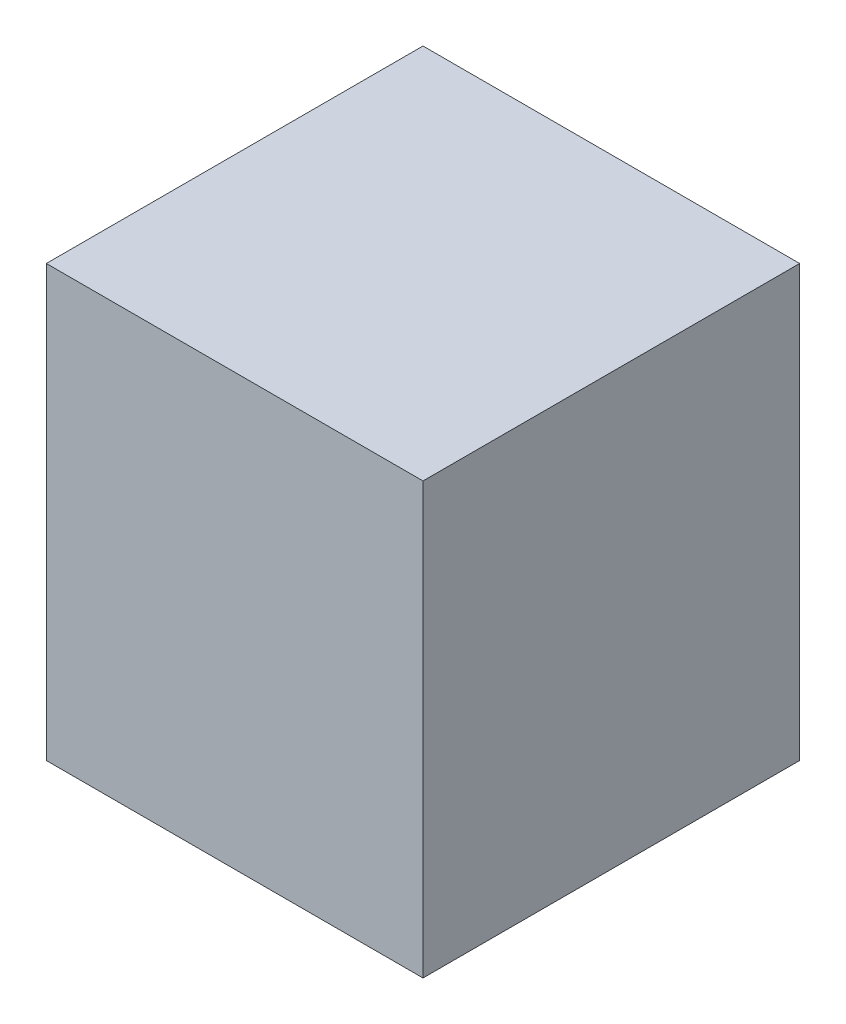
ISO-10303-21;
HEADER;
FILE_DESCRIPTION(('STEP AP214'),'2;1');
FILE_NAME('part.step','',(''),(''),'','','');
FILE_SCHEMA(('AUTOMOTIVE_DESIGN { 1 0 10303 214 1 1 1 1 }'));
ENDSEC;
DATA;
#1=APPLICATION_CONTEXT('core data for automotive mechanical design processes');
#2=APPLICATION_PROTOCOL_DEFINITION('international standard','automotive_design',2000,#1);
#3=PRODUCT_CONTEXT('',#1,'mechanical');
#4=PRODUCT('Part','Part','',(#3));
#5=PRODUCT_RELATED_PRODUCT_CATEGORY('part','',(#4));
#6=PRODUCT_DEFINITION_FORMATION('','',#4);
#7=PRODUCT_DEFINITION_CONTEXT('part definition',#1,'design');
#8=PRODUCT_DEFINITION('design','',#6,#7);
#9=PRODUCT_DEFINITION_SHAPE('','',#8);
#10=(LENGTH_UNIT() NAMED_UNIT(*) SI_UNIT(.MILLI.,.METRE.));
#11=(NAMED_UNIT(*) PLANE_ANGLE_UNIT() SI_UNIT($,.RADIAN.));
#12=(NAMED_UNIT(*) SI_UNIT($,.STERADIAN.) SOLID_ANGLE_UNIT());
#13=UNCERTAINTY_MEASURE_WITH_UNIT(LENGTH_MEASURE(1.E-05),#10,'distance_accuracy_value','');
#14=(GEOMETRIC_REPRESENTATION_CONTEXT(3) GLOBAL_UNCERTAINTY_ASSIGNED_CONTEXT((#13)) GLOBAL_UNIT_ASSIGNED_CONTEXT((#10,
#11,#12)) REPRESENTATION_CONTEXT('',''));
#15=CARTESIAN_POINT('',(0.,0.,0.));
#16=DIRECTION('',(0.,0.,1.));
#17=DIRECTION('',(1.,0.,0.));
#18=AXIS2_PLACEMENT_3D('',#15,#16,#17);
#19=CARTESIAN_POINT('',(70.,70.,60.));
#20=DIRECTION('',(-1.,0.,0.));
#21=DIRECTION('',(0.,-1.,0.));
#22=AXIS2_PLACEMENT_3D('',#19,#20,#21);
#23=PLANE('',#22);
#24=DIRECTION('',(0.,0.,-1.));
#25=VECTOR('',#24,1.);
#26=CARTESIAN_POINT('',(70.,-80.,60.));
#27=LINE('',#26,#25);
#28=CARTESIAN_POINT('',(70.,-80.,70.));
#29=VERTEX_POINT('',#28);
#30=CARTESIAN_POINT('',(70.,-80.,-70.));
#31=VERTEX_POINT('',#30);
#32=EDGE_CURVE('E271',#29,#31,#27,.T.);
#33=ORIENTED_EDGE('',*,*,#32,.T.);
#34=DIRECTION('',(0.,-1.,0.));
#35=VECTOR('',#34,1.);
#36=CARTESIAN_POINT('',(70.,80.,-70.));
#37=LINE('',#36,#35);
#38=CARTESIAN_POINT('',(70.,80.,-70.));
#39=VERTEX_POINT('',#38);
#40=EDGE_CURVE('E218',#39,#31,#37,.T.);
#41=ORIENTED_EDGE('',*,*,#40,.F.);
#42=DIRECTION('',(0.,0.,-1.));
#43=VECTOR('',#42,1.);
#44=CARTESIAN_POINT('',(70.,80.,60.));
#45=LINE('',#44,#43);
#46=CARTESIAN_POINT('',(70.,80.,70.));
#47=VERTEX_POINT('',#46);
#48=EDGE_CURVE('E71',#47,#39,#45,.T.);
#49=ORIENTED_EDGE('',*,*,#48,.F.);
#50=DIRECTION('',(0.,1.,0.));
#51=VECTOR('',#50,1.);
#52=CARTESIAN_POINT('',(70.,80.,70.));
#53=LINE('',#52,#51);
#54=EDGE_CURVE('E226',#29,#47,#53,.T.);
#55=ORIENTED_EDGE('',*,*,#54,.F.);
#56=EDGE_LOOP('',(#33,#41,#49,#55));
#57=FACE_BOUND('',#56,.T.);
#58=ADVANCED_FACE('F63',(#57),#23,.F.);
#59=CARTESIAN_POINT('',(-60.,80.,60.));
#60=DIRECTION('',(0.,-1.,0.));
#61=DIRECTION('',(0.,0.,-1.));
#62=AXIS2_PLACEMENT_3D('',#59,#60,#61);
#63=PLANE('',#62);
#64=ORIENTED_EDGE('',*,*,#48,.T.);
#65=DIRECTION('',(1.,0.,0.));
#66=VECTOR('',#65,1.);
#67=CARTESIAN_POINT('',(70.,80.,-70.));
#68=LINE('',#67,#66);
#69=CARTESIAN_POINT('',(-70.,80.,-70.));
#70=VERTEX_POINT('',#69);
#71=EDGE_CURVE('E214',#70,#39,#68,.T.);
#72=ORIENTED_EDGE('',*,*,#71,.F.);
#73=DIRECTION('',(0.,0.,-1.));
#74=VECTOR('',#73,1.);
#75=CARTESIAN_POINT('',(-70.,80.,60.));
#76=LINE('',#75,#74);
#77=CARTESIAN_POINT('',(-70.,80.,70.));
#78=VERTEX_POINT('',#77);
#79=EDGE_CURVE('E277',#78,#70,#76,.T.);
#80=ORIENTED_EDGE('',*,*,#79,.F.);
#81=DIRECTION('',(-1.,0.,0.));
#82=VECTOR('',#81,1.);
#83=CARTESIAN_POINT('',(-70.,80.,70.));
#84=LINE('',#83,#82);
#85=EDGE_CURVE('E230',#47,#78,#84,.T.);
#86=ORIENTED_EDGE('',*,*,#85,.F.);
#87=EDGE_LOOP('',(#64,#72,#80,#86));
#88=FACE_BOUND('',#87,.T.);
#89=ADVANCED_FACE('F283',(#88),#63,.F.);
#90=CARTESIAN_POINT('',(-70.,70.,60.));
#91=DIRECTION('',(1.,0.,0.));
#92=DIRECTION('',(0.,1.,0.));
#93=AXIS2_PLACEMENT_3D('',#90,#91,#92);
#94=PLANE('',#93);
#95=ORIENTED_EDGE('',*,*,#79,.T.);
#96=DIRECTION('',(0.,1.,0.));
#97=VECTOR('',#96,1.);
#98=CARTESIAN_POINT('',(-70.,80.,-70.));
#99=LINE('',#98,#97);
#100=CARTESIAN_POINT('',(-70.,-80.,-70.));
#101=VERTEX_POINT('',#100);
#102=EDGE_CURVE('E210',#101,#70,#99,.T.);
#103=ORIENTED_EDGE('',*,*,#102,.F.);
#104=DIRECTION('',(0.,0.,-1.));
#105=VECTOR('',#104,1.);
#106=CARTESIAN_POINT('',(-70.,-80.,60.));
#107=LINE('',#106,#105);
#108=CARTESIAN_POINT('',(-70.,-80.,70.));
#109=VERTEX_POINT('',#108);
#110=EDGE_CURVE('E274',#109,#101,#107,.T.);
#111=ORIENTED_EDGE('',*,*,#110,.F.);
#112=DIRECTION('',(0.,-1.,0.));
#113=VECTOR('',#112,1.);
#114=CARTESIAN_POINT('',(-70.,80.,70.));
#115=LINE('',#114,#113);
#116=EDGE_CURVE('E234',#78,#109,#115,.T.);
#117=ORIENTED_EDGE('',*,*,#116,.F.);
#118=EDGE_LOOP('',(#95,#103,#111,#117));
#119=FACE_BOUND('',#118,.T.);
#120=ADVANCED_FACE('F298',(#119),#94,.F.);
#121=CARTESIAN_POINT('',(-60.,-80.,60.));
#122=DIRECTION('',(0.,1.,0.));
#123=DIRECTION('',(0.,0.,1.));
#124=AXIS2_PLACEMENT_3D('',#121,#122,#123);
#125=PLANE('',#124);
#126=DIRECTION('',(-1.,0.,0.));
#127=VECTOR('',#126,1.);
#128=CARTESIAN_POINT('',(-60.7743887148746,-80.,62.5473854683066));
#129=LINE('',#128,#127);
#130=CARTESIAN_POINT('',(60.7743887148746,-80.,62.5473854683066));
#131=VERTEX_POINT('',#130);
#132=CARTESIAN_POINT('',(-60.7743887148746,-80.,62.5473854683066));
#133=VERTEX_POINT('',#132);
#134=EDGE_CURVE('E187',#131,#133,#129,.T.);
#135=ORIENTED_EDGE('',*,*,#134,.F.);
#136=DIRECTION('',(0.,0.,1.));
#137=VECTOR('',#136,1.);
#138=CARTESIAN_POINT('',(60.7743887148746,-80.,62.5473854683066));
#139=LINE('',#138,#137);
#140=CARTESIAN_POINT('',(60.7743887148746,-80.,-62.5473854683066));
#141=VERTEX_POINT('',#140);
#142=EDGE_CURVE('E78',#141,#131,#139,.T.);
#143=ORIENTED_EDGE('',*,*,#142,.F.);
#144=DIRECTION('',(1.,0.,0.));
#145=VECTOR('',#144,1.);
#146=CARTESIAN_POINT('',(-60.7743887148746,-80.,-62.5473854683066));
#147=LINE('',#146,#145);
#148=CARTESIAN_POINT('',(-60.7743887148746,-80.,-62.5473854683066));
#149=VERTEX_POINT('',#148);
#150=EDGE_CURVE('E174',#149,#141,#147,.T.);
#151=ORIENTED_EDGE('',*,*,#150,.F.);
#152=DIRECTION('',(0.,0.,-1.));
#153=VECTOR('',#152,1.);
#154=CARTESIAN_POINT('',(-60.7743887148746,-80.,62.5473854683066));
#155=LINE('',#154,#153);
#156=EDGE_CURVE('E178',#133,#149,#155,.T.);
#157=ORIENTED_EDGE('',*,*,#156,.F.);
#158=EDGE_LOOP('',(#135,#143,#151,#157));
#159=FACE_BOUND('',#158,.T.);
#160=ORIENTED_EDGE('',*,*,#110,.T.);
#161=DIRECTION('',(-1.,0.,0.));
#162=VECTOR('',#161,1.);
#163=CARTESIAN_POINT('',(70.,-80.,-70.));
#164=LINE('',#163,#162);
#165=EDGE_CURVE('E222',#31,#101,#164,.T.);
#166=ORIENTED_EDGE('',*,*,#165,.F.);
#167=ORIENTED_EDGE('',*,*,#32,.F.);
#168=DIRECTION('',(1.,0.,0.));
#169=VECTOR('',#168,1.);
#170=CARTESIAN_POINT('',(-70.,-80.,70.));
#171=LINE('',#170,#169);
#172=EDGE_CURVE('E238',#109,#29,#171,.T.);
#173=ORIENTED_EDGE('',*,*,#172,.F.);
#174=EDGE_LOOP('',(#160,#166,#167,#173));
#175=FACE_BOUND('',#174,.T.);
#176=ADVANCED_FACE('F293',(#159,#175),#125,.F.);
#177=CARTESIAN_POINT('',(0.,0.,70.));
#178=DIRECTION('',(0.,0.,1.));
#179=DIRECTION('',(1.,0.,0.));
#180=AXIS2_PLACEMENT_3D('',#177,#178,#179);
#181=PLANE('',#180);
#182=ORIENTED_EDGE('',*,*,#54,.T.);
#183=ORIENTED_EDGE('',*,*,#85,.T.);
#184=ORIENTED_EDGE('',*,*,#116,.T.);
#185=ORIENTED_EDGE('',*,*,#172,.T.);
#186=EDGE_LOOP('',(#182,#183,#184,#185));
#187=FACE_BOUND('',#186,.T.);
#188=ADVANCED_FACE('F295',(#187),#181,.T.);
#189=CARTESIAN_POINT('',(0.,0.,-70.));
#190=DIRECTION('',(0.,0.,-1.));
#191=DIRECTION('',(-1.,0.,0.));
#192=AXIS2_PLACEMENT_3D('',#189,#190,#191);
#193=PLANE('',#192);
#194=ORIENTED_EDGE('',*,*,#102,.T.);
#195=ORIENTED_EDGE('',*,*,#71,.T.);
#196=ORIENTED_EDGE('',*,*,#40,.T.);
#197=ORIENTED_EDGE('',*,*,#165,.T.);
#198=EDGE_LOOP('',(#194,#195,#196,#197));
#199=FACE_BOUND('',#198,.T.);
#200=ADVANCED_FACE('F288',(#199),#193,.T.);
#201=CARTESIAN_POINT('',(60.7743887148746,-40.,62.5473854683066));
#202=DIRECTION('',(1.,0.,0.));
#203=DIRECTION('',(0.,0.,-1.));
#204=AXIS2_PLACEMENT_3D('',#201,#202,#203);
#205=PLANE('',#204);
#206=ORIENTED_EDGE('',*,*,#142,.T.);
#207=DIRECTION('',(0.,-1.,0.));
#208=VECTOR('',#207,1.);
#209=CARTESIAN_POINT('',(60.7743887148746,-40.,62.5473854683066));
#210=LINE('',#209,#208);
#211=CARTESIAN_POINT('',(60.7743887148746,-40.,62.5473854683066));
#212=VERTEX_POINT('',#211);
#213=EDGE_CURVE('E149',#212,#131,#210,.T.);
#214=ORIENTED_EDGE('',*,*,#213,.F.);
#215=DIRECTION('',(0.,0.,1.));
#216=VECTOR('',#215,1.);
#217=CARTESIAN_POINT('',(60.7743887148746,-40.,62.5473854683066));
#218=LINE('',#217,#216);
#219=CARTESIAN_POINT('',(60.7743887148746,-40.,-62.5473854683066));
#220=VERTEX_POINT('',#219);
#221=EDGE_CURVE('E153',#220,#212,#218,.T.);
#222=ORIENTED_EDGE('',*,*,#221,.F.);
#223=DIRECTION('',(0.,-1.,0.));
#224=VECTOR('',#223,1.);
#225=CARTESIAN_POINT('',(60.7743887148746,-40.,-62.5473854683066));
#226=LINE('',#225,#224);
#227=EDGE_CURVE('E193',#220,#141,#226,.T.);
#228=ORIENTED_EDGE('',*,*,#227,.T.);
#229=EDGE_LOOP('',(#206,#214,#222,#228));
#230=FACE_BOUND('',#229,.T.);
#231=ADVANCED_FACE('F151',(#230),#205,.F.);
#232=CARTESIAN_POINT('',(-60.7743887148746,-40.,-62.5473854683066));
#233=DIRECTION('',(0.,0.,-1.));
#234=DIRECTION('',(-1.,0.,0.));
#235=AXIS2_PLACEMENT_3D('',#232,#233,#234);
#236=PLANE('',#235);
#237=ORIENTED_EDGE('',*,*,#150,.T.);
#238=ORIENTED_EDGE('',*,*,#227,.F.);
#239=DIRECTION('',(1.,0.,0.));
#240=VECTOR('',#239,1.);
#241=CARTESIAN_POINT('',(-60.7743887148746,-40.,-62.5473854683066));
#242=LINE('',#241,#240);
#243=CARTESIAN_POINT('',(-60.7743887148746,-40.,-62.5473854683066));
#244=VERTEX_POINT('',#243);
#245=EDGE_CURVE('E160',#244,#220,#242,.T.);
#246=ORIENTED_EDGE('',*,*,#245,.F.);
#247=DIRECTION('',(0.,-1.,0.));
#248=VECTOR('',#247,1.);
#249=CARTESIAN_POINT('',(-60.7743887148746,-40.,-62.5473854683066));
#250=LINE('',#249,#248);
#251=EDGE_CURVE('E196',#244,#149,#250,.T.);
#252=ORIENTED_EDGE('',*,*,#251,.T.);
#253=EDGE_LOOP('',(#237,#238,#246,#252));
#254=FACE_BOUND('',#253,.T.);
#255=ADVANCED_FACE('F361',(#254),#236,.F.);
#256=CARTESIAN_POINT('',(-60.7743887148746,-40.,62.5473854683066));
#257=DIRECTION('',(-1.,0.,0.));
#258=DIRECTION('',(0.,0.,1.));
#259=AXIS2_PLACEMENT_3D('',#256,#257,#258);
#260=PLANE('',#259);
#261=ORIENTED_EDGE('',*,*,#156,.T.);
#262=ORIENTED_EDGE('',*,*,#251,.F.);
#263=DIRECTION('',(0.,0.,-1.));
#264=VECTOR('',#263,1.);
#265=CARTESIAN_POINT('',(-60.7743887148746,-40.,62.5473854683066));
#266=LINE('',#265,#264);
#267=CARTESIAN_POINT('',(-60.7743887148746,-40.,62.5473854683066));
#268=VERTEX_POINT('',#267);
#269=EDGE_CURVE('E169',#268,#244,#266,.T.);
#270=ORIENTED_EDGE('',*,*,#269,.F.);
#271=DIRECTION('',(0.,-1.,0.));
#272=VECTOR('',#271,1.);
#273=CARTESIAN_POINT('',(-60.7743887148746,-40.,62.5473854683066));
#274=LINE('',#273,#272);
#275=EDGE_CURVE('E159',#268,#133,#274,.T.);
#276=ORIENTED_EDGE('',*,*,#275,.T.);
#277=EDGE_LOOP('',(#261,#262,#270,#276));
#278=FACE_BOUND('',#277,.T.);
#279=ADVANCED_FACE('F371',(#278),#260,.F.);
#280=CARTESIAN_POINT('',(-60.7743887148746,-40.,62.5473854683066));
#281=DIRECTION('',(0.,0.,1.));
#282=DIRECTION('',(1.,0.,0.));
#283=AXIS2_PLACEMENT_3D('',#280,#281,#282);
#284=PLANE('',#283);
#285=ORIENTED_EDGE('',*,*,#134,.T.);
#286=ORIENTED_EDGE('',*,*,#275,.F.);
#287=DIRECTION('',(-1.,0.,0.));
#288=VECTOR('',#287,1.);
#289=CARTESIAN_POINT('',(-60.7743887148746,-40.,62.5473854683066));
#290=LINE('',#289,#288);
#291=EDGE_CURVE('E163',#212,#268,#290,.T.);
#292=ORIENTED_EDGE('',*,*,#291,.F.);
#293=ORIENTED_EDGE('',*,*,#213,.T.);
#294=EDGE_LOOP('',(#285,#286,#292,#293));
#295=FACE_BOUND('',#294,.T.);
#296=ADVANCED_FACE('F164',(#295),#284,.F.);
#297=CARTESIAN_POINT('',(0.,-40.,0.));
#298=DIRECTION('',(0.,-1.,0.));
#299=DIRECTION('',(0.,0.,-1.));
#300=AXIS2_PLACEMENT_3D('',#297,#298,#299);
#301=PLANE('',#300);
#302=DIRECTION('',(1.,0.,0.));
#303=VECTOR('',#302,1.);
#304=CARTESIAN_POINT('',(0.,-40.,60.));
#305=LINE('',#304,#303);
#306=CARTESIAN_POINT('',(-60.,-40.,60.));
#307=VERTEX_POINT('',#306);
#308=CARTESIAN_POINT('',(60.,-40.,60.));
#309=VERTEX_POINT('',#308);
#310=EDGE_CURVE('E86',#307,#309,#305,.T.);
#311=ORIENTED_EDGE('',*,*,#310,.T.);
#312=DIRECTION('',(0.,0.,1.));
#313=VECTOR('',#312,1.);
#314=CARTESIAN_POINT('',(60.,-40.,60.));
#315=LINE('',#314,#313);
#316=CARTESIAN_POINT('',(60.,-40.,-60.));
#317=VERTEX_POINT('',#316);
#318=EDGE_CURVE('E12',#317,#309,#315,.T.);
#319=ORIENTED_EDGE('',*,*,#318,.F.);
#320=DIRECTION('',(-1.,0.,0.));
#321=VECTOR('',#320,1.);
#322=CARTESIAN_POINT('',(0.,-40.,-60.));
#323=LINE('',#322,#321);
#324=CARTESIAN_POINT('',(-60.,-40.,-60.));
#325=VERTEX_POINT('',#324);
#326=EDGE_CURVE('E203',#317,#325,#323,.T.);
#327=ORIENTED_EDGE('',*,*,#326,.T.);
#328=DIRECTION('',(0.,0.,-1.));
#329=VECTOR('',#328,1.);
#330=CARTESIAN_POINT('',(-60.,-40.,60.));
#331=LINE('',#330,#329);
#332=EDGE_CURVE('E206',#307,#325,#331,.T.);
#333=ORIENTED_EDGE('',*,*,#332,.F.);
#334=EDGE_LOOP('',(#311,#319,#327,#333));
#335=FACE_BOUND('',#334,.T.);
#336=ORIENTED_EDGE('',*,*,#221,.T.);
#337=ORIENTED_EDGE('',*,*,#291,.T.);
#338=ORIENTED_EDGE('',*,*,#269,.T.);
#339=ORIENTED_EDGE('',*,*,#245,.T.);
#340=EDGE_LOOP('',(#336,#337,#338,#339));
#341=FACE_BOUND('',#340,.T.);
#342=ADVANCED_FACE('F171',(#335,#341),#301,.T.);
#343=CARTESIAN_POINT('',(0.,0.,-60.));
#344=DIRECTION('',(0.,0.,-1.));
#345=DIRECTION('',(-1.,0.,0.));
#346=AXIS2_PLACEMENT_3D('',#343,#344,#345);
#347=PLANE('',#346);
#348=ORIENTED_EDGE('',*,*,#326,.F.);
#349=DIRECTION('',(0.,1.,0.));
#350=VECTOR('',#349,1.);
#351=CARTESIAN_POINT('',(60.,70.,-60.));
#352=LINE('',#351,#350);
#353=CARTESIAN_POINT('',(60.,70.,-60.));
#354=VERTEX_POINT('',#353);
#355=EDGE_CURVE('E242',#317,#354,#352,.T.);
#356=ORIENTED_EDGE('',*,*,#355,.T.);
#357=DIRECTION('',(-1.,0.,0.));
#358=VECTOR('',#357,1.);
#359=CARTESIAN_POINT('',(-60.,70.,-60.));
#360=LINE('',#359,#358);
#361=CARTESIAN_POINT('',(-60.,70.,-60.));
#362=VERTEX_POINT('',#361);
#363=EDGE_CURVE('E258',#354,#362,#360,.T.);
#364=ORIENTED_EDGE('',*,*,#363,.T.);
#365=DIRECTION('',(0.,-1.,0.));
#366=VECTOR('',#365,1.);
#367=CARTESIAN_POINT('',(-60.,70.,-60.));
#368=LINE('',#367,#366);
#369=EDGE_CURVE('E247',#362,#325,#368,.T.);
#370=ORIENTED_EDGE('',*,*,#369,.T.);
#371=EDGE_LOOP('',(#348,#356,#364,#370));
#372=FACE_BOUND('',#371,.T.);
#373=ADVANCED_FACE('F398',(#372),#347,.F.);
#374=CARTESIAN_POINT('',(0.,0.,60.));
#375=DIRECTION('',(0.,0.,1.));
#376=DIRECTION('',(1.,0.,0.));
#377=AXIS2_PLACEMENT_3D('',#374,#375,#376);
#378=PLANE('',#377);
#379=ORIENTED_EDGE('',*,*,#310,.F.);
#380=DIRECTION('',(0.,-1.,0.));
#381=VECTOR('',#380,1.);
#382=CARTESIAN_POINT('',(-60.,70.,60.));
#383=LINE('',#382,#381);
#384=CARTESIAN_POINT('',(-60.,70.,60.));
#385=VERTEX_POINT('',#384);
#386=EDGE_CURVE('E251',#385,#307,#383,.T.);
#387=ORIENTED_EDGE('',*,*,#386,.F.);
#388=DIRECTION('',(-1.,0.,0.));
#389=VECTOR('',#388,1.);
#390=CARTESIAN_POINT('',(-60.,70.,60.));
#391=LINE('',#390,#389);
#392=CARTESIAN_POINT('',(60.,70.,60.));
#393=VERTEX_POINT('',#392);
#394=EDGE_CURVE('E246',#393,#385,#391,.T.);
#395=ORIENTED_EDGE('',*,*,#394,.F.);
#396=DIRECTION('',(0.,1.,0.));
#397=VECTOR('',#396,1.);
#398=CARTESIAN_POINT('',(60.,70.,60.));
#399=LINE('',#398,#397);
#400=EDGE_CURVE('E243',#309,#393,#399,.T.);
#401=ORIENTED_EDGE('',*,*,#400,.F.);
#402=EDGE_LOOP('',(#379,#387,#395,#401));
#403=FACE_BOUND('',#402,.T.);
#404=ADVANCED_FACE('F406',(#403),#378,.F.);
#405=CARTESIAN_POINT('',(-60.,70.,60.));
#406=DIRECTION('',(1.,0.,0.));
#407=DIRECTION('',(0.,1.,0.));
#408=AXIS2_PLACEMENT_3D('',#405,#406,#407);
#409=PLANE('',#408);
#410=ORIENTED_EDGE('',*,*,#386,.T.);
#411=ORIENTED_EDGE('',*,*,#332,.T.);
#412=ORIENTED_EDGE('',*,*,#369,.F.);
#413=DIRECTION('',(0.,0.,-1.));
#414=VECTOR('',#413,1.);
#415=CARTESIAN_POINT('',(-60.,70.,60.));
#416=LINE('',#415,#414);
#417=EDGE_CURVE('E255',#385,#362,#416,.T.);
#418=ORIENTED_EDGE('',*,*,#417,.F.);
#419=EDGE_LOOP('',(#410,#411,#412,#418));
#420=FACE_BOUND('',#419,.T.);
#421=ADVANCED_FACE('F315',(#420),#409,.T.);
#422=CARTESIAN_POINT('',(60.,70.,60.));
#423=DIRECTION('',(-1.,0.,0.));
#424=DIRECTION('',(0.,-1.,0.));
#425=AXIS2_PLACEMENT_3D('',#422,#423,#424);
#426=PLANE('',#425);
#427=ORIENTED_EDGE('',*,*,#355,.F.);
#428=ORIENTED_EDGE('',*,*,#318,.T.);
#429=ORIENTED_EDGE('',*,*,#400,.T.);
#430=DIRECTION('',(0.,0.,-1.));
#431=VECTOR('',#430,1.);
#432=CARTESIAN_POINT('',(60.,70.,60.));
#433=LINE('',#432,#431);
#434=EDGE_CURVE('E267',#393,#354,#433,.T.);
#435=ORIENTED_EDGE('',*,*,#434,.T.);
#436=EDGE_LOOP('',(#427,#428,#429,#435));
#437=FACE_BOUND('',#436,.T.);
#438=ADVANCED_FACE('F347',(#437),#426,.T.);
#439=CARTESIAN_POINT('',(-60.,70.,60.));
#440=DIRECTION('',(0.,-1.,0.));
#441=DIRECTION('',(0.,0.,-1.));
#442=AXIS2_PLACEMENT_3D('',#439,#440,#441);
#443=PLANE('',#442);
#444=ORIENTED_EDGE('',*,*,#363,.F.);
#445=ORIENTED_EDGE('',*,*,#434,.F.);
#446=ORIENTED_EDGE('',*,*,#394,.T.);
#447=ORIENTED_EDGE('',*,*,#417,.T.);
#448=EDGE_LOOP('',(#444,#445,#446,#447));
#449=FACE_BOUND('',#448,.T.);
#450=ADVANCED_FACE('F343',(#449),#443,.T.);
#451=CLOSED_SHELL('',(#58,#89,#120,#176,#188,#200,#231,#255,#279,#296,#342,#373,#404,#421,#438,#450));
#452=MANIFOLD_SOLID_BREP('B2',#451);
#453=ADVANCED_BREP_SHAPE_REPRESENTATION('',(#18,#452),#14);
#454=SHAPE_DEFINITION_REPRESENTATION(#9,#453);
ENDSEC;
END-ISO-10303-21;
